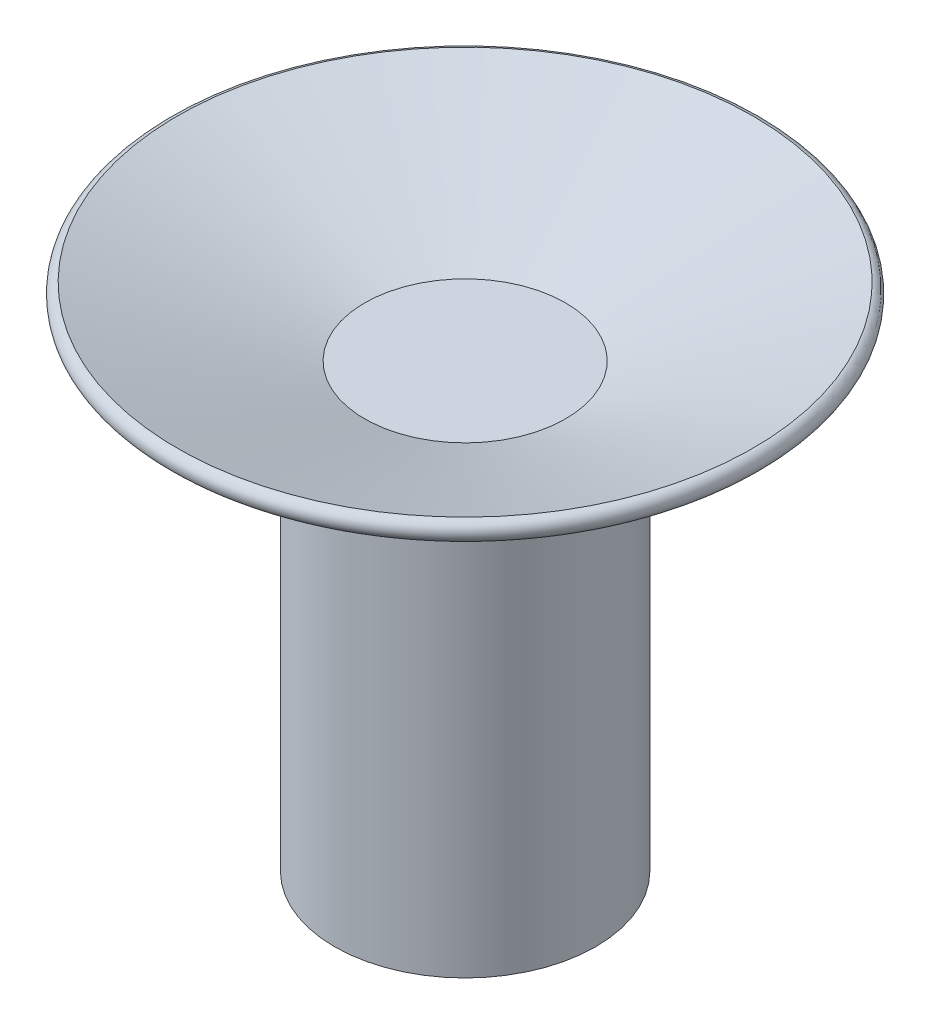
ISO-10303-21;
HEADER;
FILE_DESCRIPTION(('STEP AP214'),'2;1');
FILE_NAME('part.step','',(''),(''),'','','');
FILE_SCHEMA(('AUTOMOTIVE_DESIGN { 1 0 10303 214 1 1 1 1 }'));
ENDSEC;
DATA;
#1=APPLICATION_CONTEXT('core data for automotive mechanical design processes');
#2=APPLICATION_PROTOCOL_DEFINITION('international standard','automotive_design',2000,#1);
#3=PRODUCT_CONTEXT('',#1,'mechanical');
#4=PRODUCT('Part','Part','',(#3));
#5=PRODUCT_RELATED_PRODUCT_CATEGORY('part','',(#4));
#6=PRODUCT_DEFINITION_FORMATION('','',#4);
#7=PRODUCT_DEFINITION_CONTEXT('part definition',#1,'design');
#8=PRODUCT_DEFINITION('design','',#6,#7);
#9=PRODUCT_DEFINITION_SHAPE('','',#8);
#10=(LENGTH_UNIT() NAMED_UNIT(*) SI_UNIT(.MILLI.,.METRE.));
#11=(NAMED_UNIT(*) PLANE_ANGLE_UNIT() SI_UNIT($,.RADIAN.));
#12=(NAMED_UNIT(*) SI_UNIT($,.STERADIAN.) SOLID_ANGLE_UNIT());
#13=UNCERTAINTY_MEASURE_WITH_UNIT(LENGTH_MEASURE(1.E-05),#10,'distance_accuracy_value','');
#14=(GEOMETRIC_REPRESENTATION_CONTEXT(3) GLOBAL_UNCERTAINTY_ASSIGNED_CONTEXT((#13)) GLOBAL_UNIT_ASSIGNED_CONTEXT((#10,
#11,#12)) REPRESENTATION_CONTEXT('',''));
#15=CARTESIAN_POINT('',(0.,0.,0.));
#16=DIRECTION('',(0.,0.,1.));
#17=DIRECTION('',(1.,0.,0.));
#18=AXIS2_PLACEMENT_3D('',#15,#16,#17);
#19=CARTESIAN_POINT('',(0.,0.,0.));
#20=DIRECTION('',(0.,-1.,0.));
#21=DIRECTION('',(0.,0.,-1.));
#22=AXIS2_PLACEMENT_3D('',#19,#20,#21);
#23=PLANE('',#22);
#24=DIRECTION('',(0.997623228537443,0.,0.0689049626843327));
#25=VECTOR('',#24,1.);
#26=CARTESIAN_POINT('',(-2.19569083068635,0.,-4.4920977033052));
#27=LINE('',#26,#25);
#28=CARTESIAN_POINT('',(-2.19569083068635,0.,-4.49209770330521));
#29=VERTEX_POINT('',#28);
#30=CARTESIAN_POINT('',(2.79242531200086,0.,-4.14757288988354));
#31=VERTEX_POINT('',#30);
#32=EDGE_CURVE('E50',#29,#31,#27,.T.);
#33=ORIENTED_EDGE('',*,*,#32,.F.);
#34=CARTESIAN_POINT('',(0.,0.,0.));
#35=DIRECTION('',(0.,-1.,0.));
#36=DIRECTION('',(0.,0.,-1.));
#37=AXIS2_PLACEMENT_3D('',#34,#35,#36);
#38=CIRCLE('',#37,5.);
#39=EDGE_CURVE('E44',#29,#31,#38,.T.);
#40=ORIENTED_EDGE('',*,*,#39,.T.);
#41=EDGE_LOOP('',(#33,#40));
#42=FACE_BOUND('',#41,.T.);
#43=ADVANCED_FACE('F35',(#42),#23,.T.);
#44=DIRECTION('',(0.558485062400172,0.,-0.829514577976708));
#45=VECTOR('',#44,1.);
#46=CARTESIAN_POINT('',(-4.98811614268721,0.,-0.344524813421662));
#47=LINE('',#46,#45);
#48=CARTESIAN_POINT('',(-4.98811614268721,0.,-0.344524813421667));
#49=VERTEX_POINT('',#48);
#50=EDGE_CURVE('E57',#49,#29,#47,.T.);
#51=ORIENTED_EDGE('',*,*,#50,.F.);
#52=EDGE_CURVE('E154',#49,#29,#38,.T.);
#53=ORIENTED_EDGE('',*,*,#52,.T.);
#54=EDGE_LOOP('',(#51,#53));
#55=FACE_BOUND('',#54,.T.);
#56=ADVANCED_FACE('F205',(#55),#23,.T.);
#57=DIRECTION('',(-0.439138166137271,0.,-0.898419540661041));
#58=VECTOR('',#57,1.);
#59=CARTESIAN_POINT('',(-2.79242531200086,0.,4.14757288988354));
#60=LINE('',#59,#58);
#61=CARTESIAN_POINT('',(-2.79242531200086,0.,4.14757288988354));
#62=VERTEX_POINT('',#61);
#63=EDGE_CURVE('E130',#62,#49,#60,.T.);
#64=ORIENTED_EDGE('',*,*,#63,.F.);
#65=EDGE_CURVE('E156',#62,#49,#38,.T.);
#66=ORIENTED_EDGE('',*,*,#65,.T.);
#67=EDGE_LOOP('',(#64,#66));
#68=FACE_BOUND('',#67,.T.);
#69=ADVANCED_FACE('F209',(#68),#23,.T.);
#70=DIRECTION('',(-0.997623228537443,0.,-0.0689049626843323));
#71=VECTOR('',#70,1.);
#72=CARTESIAN_POINT('',(2.19569083068635,0.,4.4920977033052));
#73=LINE('',#72,#71);
#74=CARTESIAN_POINT('',(2.19569083068634,0.,4.49209770330521));
#75=VERTEX_POINT('',#74);
#76=EDGE_CURVE('E127',#75,#62,#73,.T.);
#77=ORIENTED_EDGE('',*,*,#76,.F.);
#78=EDGE_CURVE('E158',#75,#62,#38,.T.);
#79=ORIENTED_EDGE('',*,*,#78,.T.);
#80=EDGE_LOOP('',(#77,#79));
#81=FACE_BOUND('',#80,.T.);
#82=ADVANCED_FACE('F218',(#81),#23,.T.);
#83=DIRECTION('',(-0.558485062400172,0.,0.829514577976708));
#84=VECTOR('',#83,1.);
#85=CARTESIAN_POINT('',(4.98811614268721,0.,0.344524813421662));
#86=LINE('',#85,#84);
#87=CARTESIAN_POINT('',(4.98811614268721,0.,0.344524813421662));
#88=VERTEX_POINT('',#87);
#89=EDGE_CURVE('E124',#88,#75,#86,.T.);
#90=ORIENTED_EDGE('',*,*,#89,.F.);
#91=EDGE_CURVE('E43',#88,#75,#38,.T.);
#92=ORIENTED_EDGE('',*,*,#91,.T.);
#93=EDGE_LOOP('',(#90,#92));
#94=FACE_BOUND('',#93,.T.);
#95=ADVANCED_FACE('F168',(#94),#23,.T.);
#96=DIRECTION('',(0.43913816613727,0.,0.898419540661041));
#97=VECTOR('',#96,1.);
#98=CARTESIAN_POINT('',(2.79242531200086,0.,-4.14757288988354));
#99=LINE('',#98,#97);
#100=EDGE_CURVE('E120',#31,#88,#99,.T.);
#101=ORIENTED_EDGE('',*,*,#100,.F.);
#102=EDGE_CURVE('E11',#31,#88,#38,.T.);
#103=ORIENTED_EDGE('',*,*,#102,.T.);
#104=EDGE_LOOP('',(#101,#103));
#105=FACE_BOUND('',#104,.T.);
#106=ADVANCED_FACE('F37',(#105),#23,.T.);
#107=CARTESIAN_POINT('',(0.,0.,0.));
#108=DIRECTION('',(0.,1.,0.));
#109=DIRECTION('',(0.,0.,1.));
#110=AXIS2_PLACEMENT_3D('',#107,#108,#109);
#111=CONICAL_SURFACE('',#110,5.,1.22173047639603);
#112=CARTESIAN_POINT('',(0.,3.4202014332567,0.));
#113=DIRECTION('',(0.,-1.,0.));
#114=DIRECTION('',(0.,0.,-1.));
#115=AXIS2_PLACEMENT_3D('',#112,#113,#114);
#116=CIRCLE('',#115,14.3969262078591);
#117=CARTESIAN_POINT('',(0.,3.4202014332567,-14.3969262078591));
#118=VERTEX_POINT('',#117);
#119=EDGE_CURVE('E150',#118,#118,#116,.T.);
#120=ORIENTED_EDGE('',*,*,#119,.T.);
#121=EDGE_LOOP('',(#120));
#122=FACE_BOUND('',#121,.T.);
#123=ORIENTED_EDGE('',*,*,#102,.F.);
#124=ORIENTED_EDGE('',*,*,#39,.F.);
#125=ORIENTED_EDGE('',*,*,#52,.F.);
#126=ORIENTED_EDGE('',*,*,#65,.F.);
#127=ORIENTED_EDGE('',*,*,#78,.F.);
#128=ORIENTED_EDGE('',*,*,#91,.F.);
#129=EDGE_LOOP('',(#123,#124,#125,#126,#127,#128));
#130=FACE_BOUND('',#129,.T.);
#131=ADVANCED_FACE('F211',(#122,#130),#111,.T.);
#132=CARTESIAN_POINT('',(0.,3.89627362878787,0.));
#133=DIRECTION('',(0.,-1.,0.));
#134=DIRECTION('',(0.,0.,-1.));
#135=AXIS2_PLACEMENT_3D('',#132,#133,#134);
#136=TOROIDAL_SURFACE('',#135,14.223650099324,0.506625448578077);
#137=CARTESIAN_POINT('',(0.,4.39314449683534,0.));
#138=DIRECTION('',(0.,-1.,0.));
#139=DIRECTION('',(0.,0.,-1.));
#140=AXIS2_PLACEMENT_3D('',#137,#138,#139);
#141=CIRCLE('',#140,14.3225878860017);
#142=CARTESIAN_POINT('',(0.,4.39314449683534,-14.3225878860017));
#143=VERTEX_POINT('',#142);
#144=EDGE_CURVE('E148',#143,#143,#141,.T.);
#145=ORIENTED_EDGE('',*,*,#144,.T.);
#146=EDGE_LOOP('',(#145));
#147=FACE_BOUND('',#146,.T.);
#148=ORIENTED_EDGE('',*,*,#119,.F.);
#149=EDGE_LOOP('',(#148));
#150=FACE_BOUND('',#149,.T.);
#151=ADVANCED_FACE('F217',(#147,#150),#136,.T.);
#152=CARTESIAN_POINT('',(0.,4.39314449683534,0.));
#153=DIRECTION('',(0.,1.,0.));
#154=DIRECTION('',(0.,0.,1.));
#155=AXIS2_PLACEMENT_3D('',#152,#153,#154);
#156=CONICAL_SURFACE('',#155,14.3225878860017,1.22173047639603);
#157=CARTESIAN_POINT('',(0.,1.,0.));
#158=DIRECTION('',(0.,-1.,0.));
#159=DIRECTION('',(0.,0.,-1.));
#160=AXIS2_PLACEMENT_3D('',#157,#158,#159);
#161=CIRCLE('',#160,5.);
#162=CARTESIAN_POINT('',(0.,1.,-5.));
#163=VERTEX_POINT('',#162);
#164=EDGE_CURVE('E145',#163,#163,#161,.T.);
#165=ORIENTED_EDGE('',*,*,#164,.T.);
#166=EDGE_LOOP('',(#165));
#167=FACE_BOUND('',#166,.T.);
#168=ORIENTED_EDGE('',*,*,#144,.F.);
#169=EDGE_LOOP('',(#168));
#170=FACE_BOUND('',#169,.T.);
#171=ADVANCED_FACE('F234',(#167,#170),#156,.F.);
#172=CARTESIAN_POINT('',(5.,1.,0.));
#173=DIRECTION('',(0.,1.,0.));
#174=DIRECTION('',(0.,0.,1.));
#175=AXIS2_PLACEMENT_3D('',#172,#173,#174);
#176=PLANE('',#175);
#177=ORIENTED_EDGE('',*,*,#164,.F.);
#178=EDGE_LOOP('',(#177));
#179=FACE_BOUND('',#178,.T.);
#180=ADVANCED_FACE('F228',(#179),#176,.T.);
#181=CARTESIAN_POINT('',(-2.19569083068635,-1.,-4.4920977033052));
#182=DIRECTION('',(-0.0689049626843327,0.,0.997623228537443));
#183=DIRECTION('',(0.997623228537443,0.,0.0689049626843327));
#184=AXIS2_PLACEMENT_3D('',#181,#182,#183);
#185=PLANE('',#184);
#186=ORIENTED_EDGE('',*,*,#32,.T.);
#187=DIRECTION('',(0.,1.,0.));
#188=VECTOR('',#187,1.);
#189=CARTESIAN_POINT('',(2.79242531200086,-1.,-4.14757288988354));
#190=LINE('',#189,#188);
#191=CARTESIAN_POINT('',(2.79242531200086,-1.,-4.14757288988354));
#192=VERTEX_POINT('',#191);
#193=EDGE_CURVE('E96',#192,#31,#190,.T.);
#194=ORIENTED_EDGE('',*,*,#193,.F.);
#195=DIRECTION('',(0.997623228537443,0.,0.0689049626843327));
#196=VECTOR('',#195,1.);
#197=CARTESIAN_POINT('',(-2.19569083068635,-1.,-4.4920977033052));
#198=LINE('',#197,#196);
#199=CARTESIAN_POINT('',(-2.19569083068635,-1.,-4.4920977033052));
#200=VERTEX_POINT('',#199);
#201=EDGE_CURVE('E91',#200,#192,#198,.T.);
#202=ORIENTED_EDGE('',*,*,#201,.F.);
#203=DIRECTION('',(0.,1.,0.));
#204=VECTOR('',#203,1.);
#205=CARTESIAN_POINT('',(-2.19569083068635,-1.,-4.4920977033052));
#206=LINE('',#205,#204);
#207=EDGE_CURVE('E94',#200,#29,#206,.T.);
#208=ORIENTED_EDGE('',*,*,#207,.T.);
#209=EDGE_LOOP('',(#186,#194,#202,#208));
#210=FACE_BOUND('',#209,.T.);
#211=ADVANCED_FACE('F93',(#210),#185,.F.);
#212=CARTESIAN_POINT('',(2.79242531200086,-1.,-4.14757288988354));
#213=DIRECTION('',(-0.898419540661041,0.,0.43913816613727));
#214=DIRECTION('',(0.43913816613727,0.,0.898419540661041));
#215=AXIS2_PLACEMENT_3D('',#212,#213,#214);
#216=PLANE('',#215);
#217=ORIENTED_EDGE('',*,*,#100,.T.);
#218=DIRECTION('',(0.,1.,0.));
#219=VECTOR('',#218,1.);
#220=CARTESIAN_POINT('',(4.98811614268721,-1.,0.344524813421662));
#221=LINE('',#220,#219);
#222=CARTESIAN_POINT('',(4.98811614268721,-1.,0.344524813421662));
#223=VERTEX_POINT('',#222);
#224=EDGE_CURVE('E141',#223,#88,#221,.T.);
#225=ORIENTED_EDGE('',*,*,#224,.F.);
#226=DIRECTION('',(0.43913816613727,0.,0.898419540661041));
#227=VECTOR('',#226,1.);
#228=CARTESIAN_POINT('',(2.79242531200086,-1.,-4.14757288988354));
#229=LINE('',#228,#227);
#230=EDGE_CURVE('E100',#192,#223,#229,.T.);
#231=ORIENTED_EDGE('',*,*,#230,.F.);
#232=ORIENTED_EDGE('',*,*,#193,.T.);
#233=EDGE_LOOP('',(#217,#225,#231,#232));
#234=FACE_BOUND('',#233,.T.);
#235=ADVANCED_FACE('F220',(#234),#216,.F.);
#236=CARTESIAN_POINT('',(4.98811614268721,-1.,0.344524813421662));
#237=DIRECTION('',(-0.829514577976708,0.,-0.558485062400172));
#238=DIRECTION('',(-0.558485062400172,0.,0.829514577976708));
#239=AXIS2_PLACEMENT_3D('',#236,#237,#238);
#240=PLANE('',#239);
#241=ORIENTED_EDGE('',*,*,#89,.T.);
#242=DIRECTION('',(0.,1.,0.));
#243=VECTOR('',#242,1.);
#244=CARTESIAN_POINT('',(2.19569083068635,-1.,4.4920977033052));
#245=LINE('',#244,#243);
#246=CARTESIAN_POINT('',(2.19569083068635,-1.,4.4920977033052));
#247=VERTEX_POINT('',#246);
#248=EDGE_CURVE('E138',#247,#75,#245,.T.);
#249=ORIENTED_EDGE('',*,*,#248,.F.);
#250=DIRECTION('',(-0.558485062400172,0.,0.829514577976708));
#251=VECTOR('',#250,1.);
#252=CARTESIAN_POINT('',(4.98811614268721,-1.,0.344524813421662));
#253=LINE('',#252,#251);
#254=EDGE_CURVE('E177',#223,#247,#253,.T.);
#255=ORIENTED_EDGE('',*,*,#254,.F.);
#256=ORIENTED_EDGE('',*,*,#224,.T.);
#257=EDGE_LOOP('',(#241,#249,#255,#256));
#258=FACE_BOUND('',#257,.T.);
#259=ADVANCED_FACE('F171',(#258),#240,.F.);
#260=CARTESIAN_POINT('',(2.19569083068635,-1.,4.4920977033052));
#261=DIRECTION('',(0.0689049626843323,0.,-0.997623228537443));
#262=DIRECTION('',(-0.997623228537443,0.,-0.0689049626843323));
#263=AXIS2_PLACEMENT_3D('',#260,#261,#262);
#264=PLANE('',#263);
#265=ORIENTED_EDGE('',*,*,#76,.T.);
#266=DIRECTION('',(0.,1.,0.));
#267=VECTOR('',#266,1.);
#268=CARTESIAN_POINT('',(-2.79242531200086,-1.,4.14757288988354));
#269=LINE('',#268,#267);
#270=CARTESIAN_POINT('',(-2.79242531200086,-1.,4.14757288988354));
#271=VERTEX_POINT('',#270);
#272=EDGE_CURVE('E135',#271,#62,#269,.T.);
#273=ORIENTED_EDGE('',*,*,#272,.F.);
#274=DIRECTION('',(-0.997623228537443,0.,-0.0689049626843323));
#275=VECTOR('',#274,1.);
#276=CARTESIAN_POINT('',(2.19569083068635,-1.,4.4920977033052));
#277=LINE('',#276,#275);
#278=EDGE_CURVE('E115',#247,#271,#277,.T.);
#279=ORIENTED_EDGE('',*,*,#278,.F.);
#280=ORIENTED_EDGE('',*,*,#248,.T.);
#281=EDGE_LOOP('',(#265,#273,#279,#280));
#282=FACE_BOUND('',#281,.T.);
#283=ADVANCED_FACE('F175',(#282),#264,.F.);
#284=CARTESIAN_POINT('',(-2.79242531200086,-1.,4.14757288988354));
#285=DIRECTION('',(0.898419540661041,0.,-0.439138166137271));
#286=DIRECTION('',(-0.439138166137271,0.,-0.898419540661041));
#287=AXIS2_PLACEMENT_3D('',#284,#285,#286);
#288=PLANE('',#287);
#289=ORIENTED_EDGE('',*,*,#63,.T.);
#290=DIRECTION('',(0.,1.,0.));
#291=VECTOR('',#290,1.);
#292=CARTESIAN_POINT('',(-4.98811614268721,-1.,-0.344524813421662));
#293=LINE('',#292,#291);
#294=CARTESIAN_POINT('',(-4.98811614268721,-1.,-0.344524813421662));
#295=VERTEX_POINT('',#294);
#296=EDGE_CURVE('E108',#295,#49,#293,.T.);
#297=ORIENTED_EDGE('',*,*,#296,.F.);
#298=DIRECTION('',(-0.439138166137271,0.,-0.898419540661041));
#299=VECTOR('',#298,1.);
#300=CARTESIAN_POINT('',(-2.79242531200086,-1.,4.14757288988354));
#301=LINE('',#300,#299);
#302=EDGE_CURVE('E113',#271,#295,#301,.T.);
#303=ORIENTED_EDGE('',*,*,#302,.F.);
#304=ORIENTED_EDGE('',*,*,#272,.T.);
#305=EDGE_LOOP('',(#289,#297,#303,#304));
#306=FACE_BOUND('',#305,.T.);
#307=ADVANCED_FACE('F201',(#306),#288,.F.);
#308=CARTESIAN_POINT('',(-4.98811614268721,-1.,-0.344524813421662));
#309=DIRECTION('',(0.829514577976708,0.,0.558485062400172));
#310=DIRECTION('',(0.558485062400172,0.,-0.829514577976708));
#311=AXIS2_PLACEMENT_3D('',#308,#309,#310);
#312=PLANE('',#311);
#313=ORIENTED_EDGE('',*,*,#50,.T.);
#314=ORIENTED_EDGE('',*,*,#207,.F.);
#315=DIRECTION('',(0.558485062400172,0.,-0.829514577976708));
#316=VECTOR('',#315,1.);
#317=CARTESIAN_POINT('',(-4.98811614268721,-1.,-0.344524813421662));
#318=LINE('',#317,#316);
#319=EDGE_CURVE('E106',#295,#200,#318,.T.);
#320=ORIENTED_EDGE('',*,*,#319,.F.);
#321=ORIENTED_EDGE('',*,*,#296,.T.);
#322=EDGE_LOOP('',(#313,#314,#320,#321));
#323=FACE_BOUND('',#322,.T.);
#324=ADVANCED_FACE('F104',(#323),#312,.F.);
#325=CARTESIAN_POINT('',(0.,-1.,0.));
#326=DIRECTION('',(0.,-1.,0.));
#327=DIRECTION('',(0.,0.,-1.));
#328=AXIS2_PLACEMENT_3D('',#325,#326,#327);
#329=PLANE('',#328);
#330=CARTESIAN_POINT('',(0.,-1.,0.));
#331=DIRECTION('',(0.,-1.,0.));
#332=DIRECTION('',(0.,0.,-1.));
#333=AXIS2_PLACEMENT_3D('',#330,#331,#332);
#334=CIRCLE('',#333,6.5);
#335=CARTESIAN_POINT('',(0.,-1.,-6.5));
#336=VERTEX_POINT('',#335);
#337=EDGE_CURVE('E181',#336,#336,#334,.T.);
#338=ORIENTED_EDGE('',*,*,#337,.F.);
#339=EDGE_LOOP('',(#338));
#340=FACE_BOUND('',#339,.T.);
#341=ORIENTED_EDGE('',*,*,#319,.T.);
#342=ORIENTED_EDGE('',*,*,#201,.T.);
#343=ORIENTED_EDGE('',*,*,#230,.T.);
#344=ORIENTED_EDGE('',*,*,#254,.T.);
#345=ORIENTED_EDGE('',*,*,#278,.T.);
#346=ORIENTED_EDGE('',*,*,#302,.T.);
#347=EDGE_LOOP('',(#341,#342,#343,#344,#345,#346));
#348=FACE_BOUND('',#347,.T.);
#349=ADVANCED_FACE('F110',(#340,#348),#329,.F.);
#350=CARTESIAN_POINT('',(0.,-21.,0.));
#351=DIRECTION('',(0.,1.,0.));
#352=DIRECTION('',(0.,0.,1.));
#353=AXIS2_PLACEMENT_3D('',#350,#351,#352);
#354=CYLINDRICAL_SURFACE('',#353,6.5);
#355=CARTESIAN_POINT('',(0.,-21.,0.));
#356=DIRECTION('',(0.,-1.,0.));
#357=DIRECTION('',(0.,0.,-1.));
#358=AXIS2_PLACEMENT_3D('',#355,#356,#357);
#359=CIRCLE('',#358,6.5);
#360=CARTESIAN_POINT('',(0.,-21.,-6.5));
#361=VERTEX_POINT('',#360);
#362=EDGE_CURVE('E121',#361,#361,#359,.T.);
#363=ORIENTED_EDGE('',*,*,#362,.F.);
#364=EDGE_LOOP('',(#363));
#365=FACE_BOUND('',#364,.T.);
#366=ORIENTED_EDGE('',*,*,#337,.T.);
#367=EDGE_LOOP('',(#366));
#368=FACE_BOUND('',#367,.T.);
#369=ADVANCED_FACE('F189',(#365,#368),#354,.T.);
#370=CARTESIAN_POINT('',(0.,-21.,0.));
#371=DIRECTION('',(0.,-1.,0.));
#372=DIRECTION('',(0.,0.,-1.));
#373=AXIS2_PLACEMENT_3D('',#370,#371,#372);
#374=PLANE('',#373);
#375=ORIENTED_EDGE('',*,*,#362,.T.);
#376=EDGE_LOOP('',(#375));
#377=FACE_BOUND('',#376,.T.);
#378=ADVANCED_FACE('F187',(#377),#374,.T.);
#379=CLOSED_SHELL('',(#43,#56,#69,#82,#95,#106,#131,#151,#171,#180,#211,#235,#259,#283,#307,
#324,#349,#369,#378));
#380=MANIFOLD_SOLID_BREP('B2',#379);
#381=ADVANCED_BREP_SHAPE_REPRESENTATION('',(#18,#380),#14);
#382=SHAPE_DEFINITION_REPRESENTATION(#9,#381);
ENDSEC;
END-ISO-10303-21;
